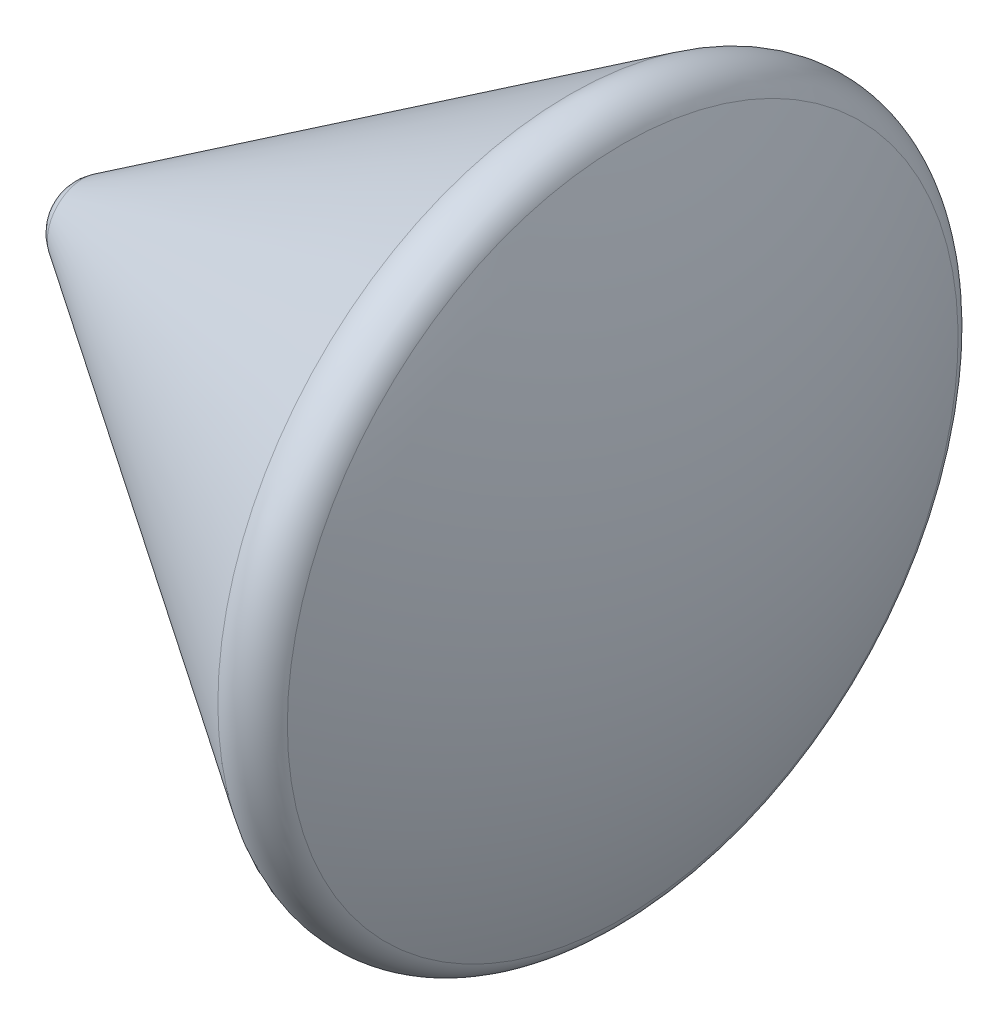
ISO-10303-21;
HEADER;
FILE_DESCRIPTION(('STEP AP214'),'2;1');
FILE_NAME('part.step','',(''),(''),'','','');
FILE_SCHEMA(('AUTOMOTIVE_DESIGN { 1 0 10303 214 1 1 1 1 }'));
ENDSEC;
DATA;
#1=APPLICATION_CONTEXT('core data for automotive mechanical design processes');
#2=APPLICATION_PROTOCOL_DEFINITION('international standard','automotive_design',2000,#1);
#3=PRODUCT_CONTEXT('',#1,'mechanical');
#4=PRODUCT('Part','Part','',(#3));
#5=PRODUCT_RELATED_PRODUCT_CATEGORY('part','',(#4));
#6=PRODUCT_DEFINITION_FORMATION('','',#4);
#7=PRODUCT_DEFINITION_CONTEXT('part definition',#1,'design');
#8=PRODUCT_DEFINITION('design','',#6,#7);
#9=PRODUCT_DEFINITION_SHAPE('','',#8);
#10=(LENGTH_UNIT() NAMED_UNIT(*) SI_UNIT(.MILLI.,.METRE.));
#11=(NAMED_UNIT(*) PLANE_ANGLE_UNIT() SI_UNIT($,.RADIAN.));
#12=(NAMED_UNIT(*) SI_UNIT($,.STERADIAN.) SOLID_ANGLE_UNIT());
#13=UNCERTAINTY_MEASURE_WITH_UNIT(LENGTH_MEASURE(1.E-05),#10,'distance_accuracy_value','');
#14=(GEOMETRIC_REPRESENTATION_CONTEXT(3) GLOBAL_UNCERTAINTY_ASSIGNED_CONTEXT((#13)) GLOBAL_UNIT_ASSIGNED_CONTEXT((#10,
#11,#12)) REPRESENTATION_CONTEXT('',''));
#15=CARTESIAN_POINT('',(0.,0.,0.));
#16=DIRECTION('',(0.,0.,1.));
#17=DIRECTION('',(1.,0.,0.));
#18=AXIS2_PLACEMENT_3D('',#15,#16,#17);
#19=CARTESIAN_POINT('',(231.,0.,0.));
#20=DIRECTION('',(-1.,0.,0.));
#21=DIRECTION('',(0.,1.,0.));
#22=AXIS2_PLACEMENT_3D('',#19,#20,#21);
#23=SPHERICAL_SURFACE('',#22,231.);
#24=CARTESIAN_POINT('',(105.18838291153,0.,0.));
#25=DIRECTION('',(-1.,0.,0.));
#26=DIRECTION('',(0.,0.,1.));
#27=AXIS2_PLACEMENT_3D('',#24,#25,#26);
#28=CIRCLE('',#27,193.732901195394);
#29=CARTESIAN_POINT('',(105.18838291153,0.,-193.732901195394));
#30=VERTEX_POINT('',#29);
#31=EDGE_CURVE('E47',#30,#30,#28,.T.);
#32=ORIENTED_EDGE('',*,*,#31,.T.);
#33=EDGE_LOOP('',(#32));
#34=FACE_BOUND('',#33,.T.);
#35=ADVANCED_FACE('F37',(#34),#23,.T.);
#36=CARTESIAN_POINT('',(-1303.,0.,0.));
#37=DIRECTION('',(-1.,0.,0.));
#38=DIRECTION('',(0.,1.,0.));
#39=AXIS2_PLACEMENT_3D('',#36,#37,#38);
#40=SPHERICAL_SURFACE('',#39,4694.);
#41=CARTESIAN_POINT('',(3025.84671646712,0.,0.));
#42=DIRECTION('',(-1.,0.,0.));
#43=DIRECTION('',(0.,0.,1.));
#44=AXIS2_PLACEMENT_3D('',#41,#42,#43);
#45=CIRCLE('',#44,1815.1369384517);
#46=CARTESIAN_POINT('',(3025.84671646712,0.,1815.1369384517));
#47=VERTEX_POINT('',#46);
#48=EDGE_CURVE('E10',#47,#47,#45,.T.);
#49=ORIENTED_EDGE('',*,*,#48,.F.);
#50=EDGE_LOOP('',(#49));
#51=FACE_BOUND('',#50,.T.);
#52=ADVANCED_FACE('F62',(#51),#40,.T.);
#53=CARTESIAN_POINT('',(2845.09384973777,0.,0.));
#54=DIRECTION('',(-1.,0.,0.));
#55=DIRECTION('',(0.,0.,1.));
#56=AXIS2_PLACEMENT_3D('',#53,#54,#55);
#57=TOROIDAL_SURFACE('',#56,1739.34511059986,196.);
#58=CARTESIAN_POINT('',(2738.34459887483,0.,0.));
#59=DIRECTION('',(-1.,0.,0.));
#60=DIRECTION('',(0.,0.,1.));
#61=AXIS2_PLACEMENT_3D('',#58,#59,#60);
#62=CIRCLE('',#61,1903.72454191717);
#63=CARTESIAN_POINT('',(2738.34459887483,0.,-1903.72454191717));
#64=VERTEX_POINT('',#63);
#65=EDGE_CURVE('E43',#64,#64,#62,.T.);
#66=ORIENTED_EDGE('',*,*,#65,.F.);
#67=EDGE_LOOP('',(#66));
#68=FACE_BOUND('',#67,.T.);
#69=ORIENTED_EDGE('',*,*,#48,.T.);
#70=EDGE_LOOP('',(#69));
#71=FACE_BOUND('',#70,.T.);
#72=ADVANCED_FACE('F57',(#68,#71),#57,.T.);
#73=CARTESIAN_POINT('',(2738.34459887483,0.,0.));
#74=DIRECTION('',(1.,0.,0.));
#75=DIRECTION('',(0.,0.,-1.));
#76=AXIS2_PLACEMENT_3D('',#73,#74,#75);
#77=CONICAL_SURFACE('',#76,1903.72454191717,0.575958653158123);
#78=CARTESIAN_POINT('',(105.18838291153,0.,-193.732901195394));
#79=CARTESIAN_POINT('',(132.617093494481,0.,-211.545314119579));
#80=CARTESIAN_POINT('',(160.045804077432,0.,-229.357727043764));
#81=CARTESIAN_POINT('',(214.903225243334,0.,-264.982552892134));
#82=CARTESIAN_POINT('',(242.331935826285,0.,-282.794965816319));
#83=CARTESIAN_POINT('',(297.189356992187,0.,-318.41979166469));
#84=CARTESIAN_POINT('',(324.618067575138,0.,-336.232204588875));
#85=CARTESIAN_POINT('',(379.47548874104,0.,-371.857030437245));
#86=CARTESIAN_POINT('',(406.904199323991,0.,-389.66944336143));
#87=CARTESIAN_POINT('',(461.761620489893,0.,-425.2942692098));
#88=CARTESIAN_POINT('',(489.190331072845,0.,-443.106682133985));
#89=CARTESIAN_POINT('',(544.047752238747,0.,-478.731507982356));
#90=CARTESIAN_POINT('',(571.476462821698,0.,-496.543920906541));
#91=CARTESIAN_POINT('',(626.3338839876,0.,-532.168746754911));
#92=CARTESIAN_POINT('',(653.762594570551,0.,-549.981159679096));
#93=CARTESIAN_POINT('',(708.620015736453,0.,-585.605985527467));
#94=CARTESIAN_POINT('',(736.048726319404,0.,-603.418398451652));
#95=CARTESIAN_POINT('',(790.906147485306,0.,-639.043224300022));
#96=CARTESIAN_POINT('',(818.334858068257,0.,-656.855637224207));
#97=CARTESIAN_POINT('',(873.192279234159,0.,-692.480463072577));
#98=CARTESIAN_POINT('',(900.62098981711,0.,-710.292875996762));
#99=CARTESIAN_POINT('',(955.478410983012,0.,-745.917701845132));
#100=CARTESIAN_POINT('',(982.907121565964,0.,-763.730114769318));
#101=CARTESIAN_POINT('',(1037.76454273187,0.,-799.354940617688));
#102=CARTESIAN_POINT('',(1065.19325331482,0.,-817.167353541873));
#103=CARTESIAN_POINT('',(1120.05067448072,0.,-852.792179390243));
#104=CARTESIAN_POINT('',(1147.47938506367,0.,-870.604592314428));
#105=CARTESIAN_POINT('',(1202.33680622957,0.,-906.229418162799));
#106=CARTESIAN_POINT('',(1229.76551681252,0.,-924.041831086984));
#107=CARTESIAN_POINT('',(1284.62293797843,0.,-959.666656935354));
#108=CARTESIAN_POINT('',(1312.05164856138,0.,-977.479069859539));
#109=CARTESIAN_POINT('',(1366.90906972728,0.,-1013.10389570791));
#110=CARTESIAN_POINT('',(1394.33778031023,0.,-1030.91630863209));
#111=CARTESIAN_POINT('',(1449.19520147613,0.,-1066.54113448046));
#112=CARTESIAN_POINT('',(1476.62391205908,0.,-1084.35354740465));
#113=CARTESIAN_POINT('',(1531.48133322498,0.,-1119.97837325302));
#114=CARTESIAN_POINT('',(1558.91004380794,0.,-1137.79078617721));
#115=CARTESIAN_POINT('',(1613.76746497384,0.,-1173.41561202558));
#116=CARTESIAN_POINT('',(1641.19617555679,0.,-1191.22802494976));
#117=CARTESIAN_POINT('',(1696.05359672269,0.,-1226.85285079813));
#118=CARTESIAN_POINT('',(1723.48230730564,0.,-1244.66526372232));
#119=CARTESIAN_POINT('',(1778.33972847154,0.,-1280.29008957069));
#120=CARTESIAN_POINT('',(1805.7684390545,0.,-1298.10250249487));
#121=CARTESIAN_POINT('',(1860.6258602204,0.,-1333.72732834324));
#122=CARTESIAN_POINT('',(1888.05457080335,0.,-1351.53974126743));
#123=CARTESIAN_POINT('',(1942.91199196925,0.,-1387.1645671158));
#124=CARTESIAN_POINT('',(1970.3407025522,0.,-1404.97698003998));
#125=CARTESIAN_POINT('',(2025.1981237181,0.,-1440.60180588835));
#126=CARTESIAN_POINT('',(2052.62683430105,0.,-1458.41421881254));
#127=CARTESIAN_POINT('',(2107.48425546696,0.,-1494.03904466091));
#128=CARTESIAN_POINT('',(2134.91296604991,0.,-1511.85145758509));
#129=CARTESIAN_POINT('',(2189.77038721581,0.,-1547.47628343346));
#130=CARTESIAN_POINT('',(2217.19909779876,0.,-1565.28869635765));
#131=CARTESIAN_POINT('',(2272.05651896466,0.,-1600.91352220602));
#132=CARTESIAN_POINT('',(2299.48522954761,0.,-1618.7259351302));
#133=CARTESIAN_POINT('',(2354.34265071352,0.,-1654.35076097857));
#134=CARTESIAN_POINT('',(2381.77136129647,0.,-1672.16317390276));
#135=CARTESIAN_POINT('',(2436.62878246237,0.,-1707.78799975113));
#136=CARTESIAN_POINT('',(2464.05749304532,0.,-1725.60041267531));
#137=CARTESIAN_POINT('',(2518.91491421122,0.,-1761.22523852368));
#138=CARTESIAN_POINT('',(2546.34362479417,0.,-1779.03765144787));
#139=CARTESIAN_POINT('',(2601.20104596008,0.,-1814.66247729624));
#140=CARTESIAN_POINT('',(2628.62975654303,0.,-1832.47489022042));
#141=CARTESIAN_POINT('',(2683.48717770893,0.,-1868.0997160688));
#142=CARTESIAN_POINT('',(2710.91588829188,0.,-1885.91212899298));
#143=CARTESIAN_POINT('',(2738.34459887483,0.,-1903.72454191717));
#144=B_SPLINE_CURVE_WITH_KNOTS('',3,(#78,#79,#80,#81,#82,#83,#84,#85,#86,#87,#88,#89,#90,#91,
#92,#93,#94,#95,#96,#97,#98,#99,#100,#101,#102,#103,#104,#105,#106,#107,#108,#109,#110,#111,
#112,#113,#114,#115,#116,#117,#118,#119,#120,#121,#122,#123,#124,#125,#126,#127,#128,#129,#130,
#131,#132,#133,#134,#135,#136,#137,#138,#139,#140,#141,#142,#143),.UNSPECIFIED.,.F.,.F.,(4,2,2,
2,2,2,2,2,2,2,2,2,2,2,2,2,2,2,2,2,2,2,2,2,2,2,2,2,2,2,2,2,4),(0.,98.1149630067946,
196.22992601359,294.344889020384,392.459852027179,490.574815033974,588.689778040769,
686.804741047564,784.919704054359,883.034667061153,981.149630067948,1079.26459307474,
1177.37955608154,1275.49451908833,1373.60948209513,1471.72444510192,1569.83940810872,
1667.95437111551,1766.06933412231,1864.1842971291,1962.2992601359,2060.41422314269,
2158.52918614949,2256.64414915628,2354.75911216308,2452.87407516987,2550.98903817667,
2649.10400118346,2747.21896419026,2845.33392719705,2943.44889020384,3041.56385321064,
3139.67881621743),.UNSPECIFIED.);
#145=EDGE_CURVE('BSEAM55',#30,#64,#144,.T.);
#146=ORIENTED_EDGE('',*,*,#31,.F.);
#147=ORIENTED_EDGE('',*,*,#65,.T.);
#148=ORIENTED_EDGE('',*,*,#145,.T.);
#149=ORIENTED_EDGE('',*,*,#145,.F.);
#150=EDGE_LOOP('',(#146,#148,#147,#149));
#151=FACE_BOUND('',#150,.T.);
#152=ADVANCED_FACE('F55',(#151),#77,.T.);
#153=CLOSED_SHELL('',(#35,#52,#72,#152));
#154=MANIFOLD_SOLID_BREP('B2',#153);
#155=ADVANCED_BREP_SHAPE_REPRESENTATION('',(#18,#154),#14);
#156=SHAPE_DEFINITION_REPRESENTATION(#9,#155);
ENDSEC;
END-ISO-10303-21;
